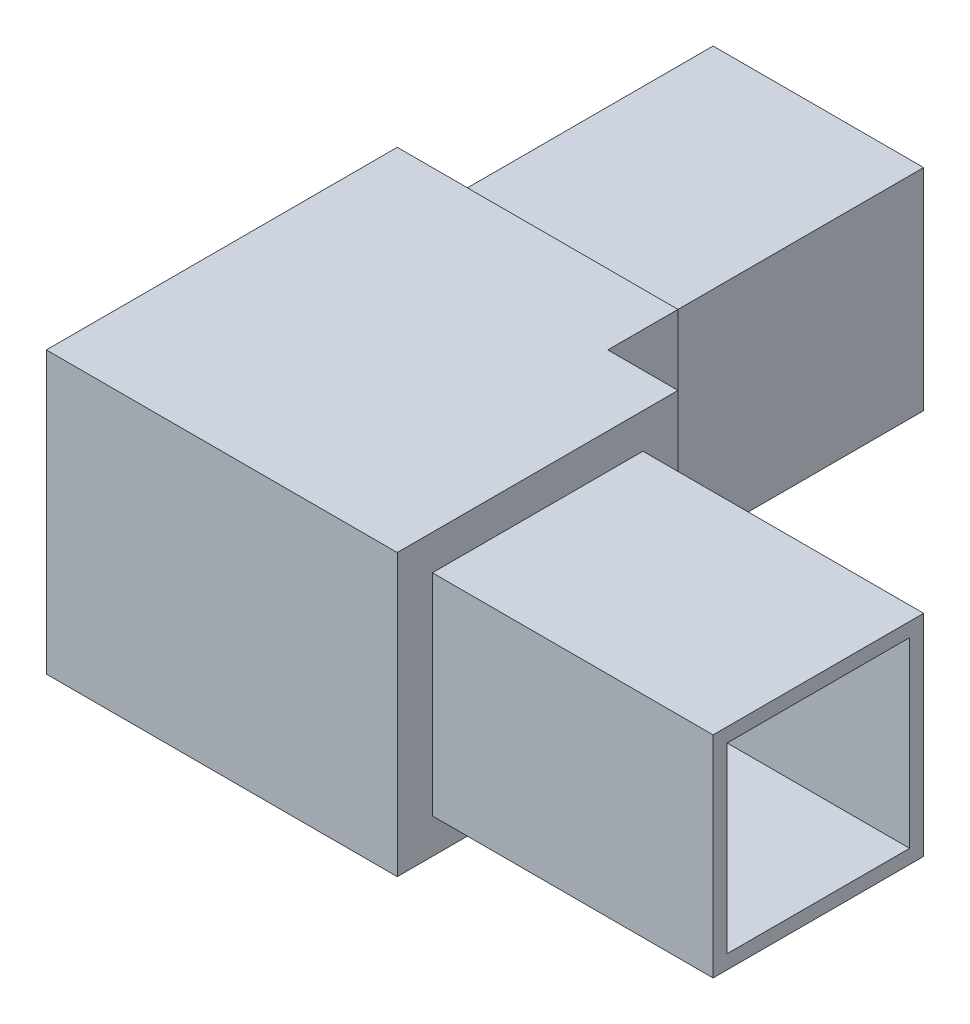
ISO-10303-21;
HEADER;
FILE_DESCRIPTION(('STEP AP214'),'2;1');
FILE_NAME('part.step','',(''),(''),'','','');
FILE_SCHEMA(('AUTOMOTIVE_DESIGN { 1 0 10303 214 1 1 1 1 }'));
ENDSEC;
DATA;
#1=APPLICATION_CONTEXT('core data for automotive mechanical design processes');
#2=APPLICATION_PROTOCOL_DEFINITION('international standard','automotive_design',2000,#1);
#3=PRODUCT_CONTEXT('',#1,'mechanical');
#4=PRODUCT('Part','Part','',(#3));
#5=PRODUCT_RELATED_PRODUCT_CATEGORY('part','',(#4));
#6=PRODUCT_DEFINITION_FORMATION('','',#4);
#7=PRODUCT_DEFINITION_CONTEXT('part definition',#1,'design');
#8=PRODUCT_DEFINITION('design','',#6,#7);
#9=PRODUCT_DEFINITION_SHAPE('','',#8);
#10=(LENGTH_UNIT() NAMED_UNIT(*) SI_UNIT(.MILLI.,.METRE.));
#11=(NAMED_UNIT(*) PLANE_ANGLE_UNIT() SI_UNIT($,.RADIAN.));
#12=(NAMED_UNIT(*) SI_UNIT($,.STERADIAN.) SOLID_ANGLE_UNIT());
#13=UNCERTAINTY_MEASURE_WITH_UNIT(LENGTH_MEASURE(1.E-05),#10,'distance_accuracy_value','');
#14=(GEOMETRIC_REPRESENTATION_CONTEXT(3) GLOBAL_UNCERTAINTY_ASSIGNED_CONTEXT((#13)) GLOBAL_UNIT_ASSIGNED_CONTEXT((#10,
#11,#12)) REPRESENTATION_CONTEXT('',''));
#15=CARTESIAN_POINT('',(0.,0.,0.));
#16=DIRECTION('',(0.,0.,1.));
#17=DIRECTION('',(1.,0.,0.));
#18=AXIS2_PLACEMENT_3D('',#15,#16,#17);
#19=CARTESIAN_POINT('',(70.,40.,-17.9567336544027));
#20=DIRECTION('',(-1.,0.,0.));
#21=DIRECTION('',(0.,0.,1.));
#22=AXIS2_PLACEMENT_3D('',#19,#20,#21);
#23=PLANE('',#22);
#24=DIRECTION('',(0.,-1.,0.));
#25=VECTOR('',#24,1.);
#26=CARTESIAN_POINT('',(70.,35.,15.));
#27=LINE('',#26,#25);
#28=CARTESIAN_POINT('',(70.,35.,15.));
#29=VERTEX_POINT('',#28);
#30=CARTESIAN_POINT('',(70.,5.,15.));
#31=VERTEX_POINT('',#30);
#32=EDGE_CURVE('E374',#29,#31,#27,.T.);
#33=ORIENTED_EDGE('',*,*,#32,.T.);
#34=DIRECTION('',(0.,0.,-1.));
#35=VECTOR('',#34,1.);
#36=CARTESIAN_POINT('',(70.,5.,15.));
#37=LINE('',#36,#35);
#38=CARTESIAN_POINT('',(70.,5.,-15.));
#39=VERTEX_POINT('',#38);
#40=EDGE_CURVE('E391',#31,#39,#37,.T.);
#41=ORIENTED_EDGE('',*,*,#40,.T.);
#42=DIRECTION('',(0.,1.,0.));
#43=VECTOR('',#42,1.);
#44=CARTESIAN_POINT('',(70.,5.,-15.));
#45=LINE('',#44,#43);
#46=CARTESIAN_POINT('',(70.,35.,-15.));
#47=VERTEX_POINT('',#46);
#48=EDGE_CURVE('E394',#39,#47,#45,.T.);
#49=ORIENTED_EDGE('',*,*,#48,.T.);
#50=DIRECTION('',(0.,0.,1.));
#51=VECTOR('',#50,1.);
#52=CARTESIAN_POINT('',(70.,35.,-15.));
#53=LINE('',#52,#51);
#54=EDGE_CURVE('E379',#47,#29,#53,.T.);
#55=ORIENTED_EDGE('',*,*,#54,.T.);
#56=EDGE_LOOP('',(#33,#41,#49,#55));
#57=FACE_BOUND('',#56,.T.);
#58=DIRECTION('',(0.,-1.,0.));
#59=VECTOR('',#58,1.);
#60=CARTESIAN_POINT('',(70.,35.,13.));
#61=LINE('',#60,#59);
#62=CARTESIAN_POINT('',(70.,33.,13.));
#63=VERTEX_POINT('',#62);
#64=CARTESIAN_POINT('',(70.,7.,13.));
#65=VERTEX_POINT('',#64);
#66=EDGE_CURVE('E230',#63,#65,#61,.T.);
#67=ORIENTED_EDGE('',*,*,#66,.F.);
#68=DIRECTION('',(0.,0.,1.));
#69=VECTOR('',#68,1.);
#70=CARTESIAN_POINT('',(70.,33.,-15.));
#71=LINE('',#70,#69);
#72=CARTESIAN_POINT('',(70.,33.,-13.));
#73=VERTEX_POINT('',#72);
#74=EDGE_CURVE('E288',#73,#63,#71,.T.);
#75=ORIENTED_EDGE('',*,*,#74,.F.);
#76=DIRECTION('',(0.,1.,0.));
#77=VECTOR('',#76,1.);
#78=CARTESIAN_POINT('',(70.,5.,-13.));
#79=LINE('',#78,#77);
#80=CARTESIAN_POINT('',(70.,7.,-13.));
#81=VERTEX_POINT('',#80);
#82=EDGE_CURVE('E47',#81,#73,#79,.T.);
#83=ORIENTED_EDGE('',*,*,#82,.F.);
#84=DIRECTION('',(0.,0.,-1.));
#85=VECTOR('',#84,1.);
#86=CARTESIAN_POINT('',(70.,7.,15.));
#87=LINE('',#86,#85);
#88=EDGE_CURVE('E319',#65,#81,#87,.T.);
#89=ORIENTED_EDGE('',*,*,#88,.F.);
#90=EDGE_LOOP('',(#67,#75,#83,#89));
#91=FACE_BOUND('',#90,.T.);
#92=ADVANCED_FACE('F32',(#57,#91),#23,.F.);
#93=CARTESIAN_POINT('',(-103.501393306404,40.,-17.9567336544027));
#94=DIRECTION('',(0.,1.,0.));
#95=DIRECTION('',(0.,0.,1.));
#96=AXIS2_PLACEMENT_3D('',#93,#94,#95);
#97=PLANE('',#96);
#98=DIRECTION('',(0.,0.,-1.));
#99=VECTOR('',#98,1.);
#100=CARTESIAN_POINT('',(20.,40.,-17.9567336544027));
#101=LINE('',#100,#99);
#102=CARTESIAN_POINT('',(20.,40.,-20.));
#103=VERTEX_POINT('',#102);
#104=CARTESIAN_POINT('',(20.,40.,-30.));
#105=VERTEX_POINT('',#104);
#106=EDGE_CURVE('E425',#103,#105,#101,.T.);
#107=ORIENTED_EDGE('',*,*,#106,.T.);
#108=DIRECTION('',(1.,0.,0.));
#109=VECTOR('',#108,1.);
#110=CARTESIAN_POINT('',(-20.,40.,-30.));
#111=LINE('',#110,#109);
#112=CARTESIAN_POINT('',(-20.,40.,-30.));
#113=VERTEX_POINT('',#112);
#114=EDGE_CURVE('E372',#113,#105,#111,.T.);
#115=ORIENTED_EDGE('',*,*,#114,.F.);
#116=DIRECTION('',(0.,0.,-1.));
#117=VECTOR('',#116,1.);
#118=CARTESIAN_POINT('',(-20.,40.,-17.9567336544027));
#119=LINE('',#118,#117);
#120=CARTESIAN_POINT('',(-20.,40.,20.));
#121=VERTEX_POINT('',#120);
#122=EDGE_CURVE('E416',#121,#113,#119,.T.);
#123=ORIENTED_EDGE('',*,*,#122,.F.);
#124=DIRECTION('',(-1.,0.,0.));
#125=VECTOR('',#124,1.);
#126=CARTESIAN_POINT('',(-103.501393306404,40.,20.));
#127=LINE('',#126,#125);
#128=CARTESIAN_POINT('',(30.,40.,20.));
#129=VERTEX_POINT('',#128);
#130=EDGE_CURVE('E419',#129,#121,#127,.T.);
#131=ORIENTED_EDGE('',*,*,#130,.F.);
#132=DIRECTION('',(0.,0.,1.));
#133=VECTOR('',#132,1.);
#134=CARTESIAN_POINT('',(30.,40.,-20.));
#135=LINE('',#134,#133);
#136=CARTESIAN_POINT('',(30.,40.,-20.));
#137=VERTEX_POINT('',#136);
#138=EDGE_CURVE('E413',#137,#129,#135,.T.);
#139=ORIENTED_EDGE('',*,*,#138,.F.);
#140=DIRECTION('',(1.,0.,0.));
#141=VECTOR('',#140,1.);
#142=CARTESIAN_POINT('',(-103.501393306404,40.,-20.));
#143=LINE('',#142,#141);
#144=EDGE_CURVE('E422',#103,#137,#143,.T.);
#145=ORIENTED_EDGE('',*,*,#144,.F.);
#146=EDGE_LOOP('',(#107,#115,#123,#131,#139,#145));
#147=FACE_BOUND('',#146,.T.);
#148=ADVANCED_FACE('F456',(#147),#97,.T.);
#149=CARTESIAN_POINT('',(-103.501393306404,0.,-17.9567336544027));
#150=DIRECTION('',(0.,1.,0.));
#151=DIRECTION('',(0.,0.,1.));
#152=AXIS2_PLACEMENT_3D('',#149,#150,#151);
#153=PLANE('',#152);
#154=DIRECTION('',(-1.,0.,0.));
#155=VECTOR('',#154,1.);
#156=CARTESIAN_POINT('',(20.,0.,-30.));
#157=LINE('',#156,#155);
#158=CARTESIAN_POINT('',(20.,0.,-30.));
#159=VERTEX_POINT('',#158);
#160=CARTESIAN_POINT('',(-20.,0.,-30.));
#161=VERTEX_POINT('',#160);
#162=EDGE_CURVE('E368',#159,#161,#157,.T.);
#163=ORIENTED_EDGE('',*,*,#162,.F.);
#164=DIRECTION('',(0.,0.,-1.));
#165=VECTOR('',#164,1.);
#166=CARTESIAN_POINT('',(20.,0.,-17.9567336544027));
#167=LINE('',#166,#165);
#168=CARTESIAN_POINT('',(20.,0.,-20.));
#169=VERTEX_POINT('',#168);
#170=EDGE_CURVE('E420',#169,#159,#167,.T.);
#171=ORIENTED_EDGE('',*,*,#170,.F.);
#172=DIRECTION('',(1.,0.,0.));
#173=VECTOR('',#172,1.);
#174=CARTESIAN_POINT('',(-103.501393306404,0.,-20.));
#175=LINE('',#174,#173);
#176=CARTESIAN_POINT('',(30.,0.,-20.));
#177=VERTEX_POINT('',#176);
#178=EDGE_CURVE('E432',#169,#177,#175,.T.);
#179=ORIENTED_EDGE('',*,*,#178,.T.);
#180=DIRECTION('',(0.,0.,-1.));
#181=VECTOR('',#180,1.);
#182=CARTESIAN_POINT('',(30.,0.,20.));
#183=LINE('',#182,#181);
#184=CARTESIAN_POINT('',(30.,0.,20.));
#185=VERTEX_POINT('',#184);
#186=EDGE_CURVE('E409',#185,#177,#183,.T.);
#187=ORIENTED_EDGE('',*,*,#186,.F.);
#188=DIRECTION('',(-1.,0.,0.));
#189=VECTOR('',#188,1.);
#190=CARTESIAN_POINT('',(-103.501393306404,0.,20.));
#191=LINE('',#190,#189);
#192=CARTESIAN_POINT('',(-20.,0.,20.));
#193=VERTEX_POINT('',#192);
#194=EDGE_CURVE('E430',#185,#193,#191,.T.);
#195=ORIENTED_EDGE('',*,*,#194,.T.);
#196=DIRECTION('',(0.,0.,-1.));
#197=VECTOR('',#196,1.);
#198=CARTESIAN_POINT('',(-20.,0.,-17.9567336544027));
#199=LINE('',#198,#197);
#200=EDGE_CURVE('E415',#193,#161,#199,.T.);
#201=ORIENTED_EDGE('',*,*,#200,.T.);
#202=EDGE_LOOP('',(#163,#171,#179,#187,#195,#201));
#203=FACE_BOUND('',#202,.T.);
#204=ADVANCED_FACE('F446',(#203),#153,.F.);
#205=CARTESIAN_POINT('',(-20.,40.,-17.9567336544027));
#206=DIRECTION('',(-1.,0.,0.));
#207=DIRECTION('',(0.,0.,1.));
#208=AXIS2_PLACEMENT_3D('',#205,#206,#207);
#209=PLANE('',#208);
#210=ORIENTED_EDGE('',*,*,#122,.T.);
#211=DIRECTION('',(0.,1.,0.));
#212=VECTOR('',#211,1.);
#213=CARTESIAN_POINT('',(-20.,0.,-30.));
#214=LINE('',#213,#212);
#215=EDGE_CURVE('E370',#161,#113,#214,.T.);
#216=ORIENTED_EDGE('',*,*,#215,.F.);
#217=ORIENTED_EDGE('',*,*,#200,.F.);
#218=DIRECTION('',(0.,-1.,0.));
#219=VECTOR('',#218,1.);
#220=CARTESIAN_POINT('',(-20.,40.,20.));
#221=LINE('',#220,#219);
#222=EDGE_CURVE('E11',#121,#193,#221,.T.);
#223=ORIENTED_EDGE('',*,*,#222,.F.);
#224=EDGE_LOOP('',(#210,#216,#217,#223));
#225=FACE_BOUND('',#224,.T.);
#226=ADVANCED_FACE('F34',(#225),#209,.T.);
#227=CARTESIAN_POINT('',(20.,40.,-17.9567336544027));
#228=DIRECTION('',(-1.,0.,0.));
#229=DIRECTION('',(0.,0.,1.));
#230=AXIS2_PLACEMENT_3D('',#227,#228,#229);
#231=PLANE('',#230);
#232=DIRECTION('',(0.,-1.,0.));
#233=VECTOR('',#232,1.);
#234=CARTESIAN_POINT('',(20.,40.,-30.));
#235=LINE('',#234,#233);
#236=EDGE_CURVE('E360',#105,#159,#235,.T.);
#237=ORIENTED_EDGE('',*,*,#236,.F.);
#238=ORIENTED_EDGE('',*,*,#106,.F.);
#239=DIRECTION('',(0.,-1.,0.));
#240=VECTOR('',#239,1.);
#241=CARTESIAN_POINT('',(20.,40.,-20.));
#242=LINE('',#241,#240);
#243=EDGE_CURVE('E40',#103,#169,#242,.T.);
#244=ORIENTED_EDGE('',*,*,#243,.T.);
#245=ORIENTED_EDGE('',*,*,#170,.T.);
#246=EDGE_LOOP('',(#237,#238,#244,#245));
#247=FACE_BOUND('',#246,.T.);
#248=ADVANCED_FACE('F440',(#247),#231,.F.);
#249=CARTESIAN_POINT('',(-103.501393306404,40.,20.));
#250=DIRECTION('',(0.,0.,1.));
#251=DIRECTION('',(1.,0.,0.));
#252=AXIS2_PLACEMENT_3D('',#249,#250,#251);
#253=PLANE('',#252);
#254=ORIENTED_EDGE('',*,*,#194,.F.);
#255=DIRECTION('',(0.,-1.,0.));
#256=VECTOR('',#255,1.);
#257=CARTESIAN_POINT('',(30.,40.,20.));
#258=LINE('',#257,#256);
#259=EDGE_CURVE('E401',#129,#185,#258,.T.);
#260=ORIENTED_EDGE('',*,*,#259,.F.);
#261=ORIENTED_EDGE('',*,*,#130,.T.);
#262=ORIENTED_EDGE('',*,*,#222,.T.);
#263=EDGE_LOOP('',(#254,#260,#261,#262));
#264=FACE_BOUND('',#263,.T.);
#265=ADVANCED_FACE('F462',(#264),#253,.T.);
#266=CARTESIAN_POINT('',(-103.501393306404,40.,-20.));
#267=DIRECTION('',(0.,0.,-1.));
#268=DIRECTION('',(-1.,0.,0.));
#269=AXIS2_PLACEMENT_3D('',#266,#267,#268);
#270=PLANE('',#269);
#271=ORIENTED_EDGE('',*,*,#144,.T.);
#272=DIRECTION('',(0.,1.,0.));
#273=VECTOR('',#272,1.);
#274=CARTESIAN_POINT('',(30.,0.,-20.));
#275=LINE('',#274,#273);
#276=EDGE_CURVE('E411',#177,#137,#275,.T.);
#277=ORIENTED_EDGE('',*,*,#276,.F.);
#278=ORIENTED_EDGE('',*,*,#178,.F.);
#279=ORIENTED_EDGE('',*,*,#243,.F.);
#280=EDGE_LOOP('',(#271,#277,#278,#279));
#281=FACE_BOUND('',#280,.T.);
#282=ADVANCED_FACE('F449',(#281),#270,.T.);
#283=CARTESIAN_POINT('',(30.,0.,20.));
#284=DIRECTION('',(1.,0.,0.));
#285=DIRECTION('',(0.,0.,-1.));
#286=AXIS2_PLACEMENT_3D('',#283,#284,#285);
#287=PLANE('',#286);
#288=DIRECTION('',(0.,0.,1.));
#289=VECTOR('',#288,1.);
#290=CARTESIAN_POINT('',(30.,35.,-15.));
#291=LINE('',#290,#289);
#292=CARTESIAN_POINT('',(30.,35.,-15.));
#293=VERTEX_POINT('',#292);
#294=CARTESIAN_POINT('',(30.,35.,15.));
#295=VERTEX_POINT('',#294);
#296=EDGE_CURVE('E385',#293,#295,#291,.T.);
#297=ORIENTED_EDGE('',*,*,#296,.F.);
#298=DIRECTION('',(0.,1.,0.));
#299=VECTOR('',#298,1.);
#300=CARTESIAN_POINT('',(30.,5.,-15.));
#301=LINE('',#300,#299);
#302=CARTESIAN_POINT('',(30.,5.,-15.));
#303=VERTEX_POINT('',#302);
#304=EDGE_CURVE('E382',#303,#293,#301,.T.);
#305=ORIENTED_EDGE('',*,*,#304,.F.);
#306=DIRECTION('',(0.,0.,-1.));
#307=VECTOR('',#306,1.);
#308=CARTESIAN_POINT('',(30.,5.,15.));
#309=LINE('',#308,#307);
#310=CARTESIAN_POINT('',(30.,5.,15.));
#311=VERTEX_POINT('',#310);
#312=EDGE_CURVE('E378',#311,#303,#309,.T.);
#313=ORIENTED_EDGE('',*,*,#312,.F.);
#314=DIRECTION('',(0.,-1.,0.));
#315=VECTOR('',#314,1.);
#316=CARTESIAN_POINT('',(30.,35.,15.));
#317=LINE('',#316,#315);
#318=EDGE_CURVE('E375',#295,#311,#317,.T.);
#319=ORIENTED_EDGE('',*,*,#318,.F.);
#320=EDGE_LOOP('',(#297,#305,#313,#319));
#321=FACE_BOUND('',#320,.T.);
#322=ORIENTED_EDGE('',*,*,#259,.T.);
#323=ORIENTED_EDGE('',*,*,#186,.T.);
#324=ORIENTED_EDGE('',*,*,#276,.T.);
#325=ORIENTED_EDGE('',*,*,#138,.T.);
#326=EDGE_LOOP('',(#322,#323,#324,#325));
#327=FACE_BOUND('',#326,.T.);
#328=ADVANCED_FACE('F452',(#321,#327),#287,.T.);
#329=CARTESIAN_POINT('',(30.,35.,15.));
#330=DIRECTION('',(0.,0.,1.));
#331=DIRECTION('',(1.,0.,0.));
#332=AXIS2_PLACEMENT_3D('',#329,#330,#331);
#333=PLANE('',#332);
#334=ORIENTED_EDGE('',*,*,#32,.F.);
#335=DIRECTION('',(1.,0.,0.));
#336=VECTOR('',#335,1.);
#337=CARTESIAN_POINT('',(30.,35.,15.));
#338=LINE('',#337,#336);
#339=EDGE_CURVE('E399',#295,#29,#338,.T.);
#340=ORIENTED_EDGE('',*,*,#339,.F.);
#341=ORIENTED_EDGE('',*,*,#318,.T.);
#342=DIRECTION('',(1.,0.,0.));
#343=VECTOR('',#342,1.);
#344=CARTESIAN_POINT('',(30.,5.,15.));
#345=LINE('',#344,#343);
#346=EDGE_CURVE('E388',#311,#31,#345,.T.);
#347=ORIENTED_EDGE('',*,*,#346,.T.);
#348=EDGE_LOOP('',(#334,#340,#341,#347));
#349=FACE_BOUND('',#348,.T.);
#350=ADVANCED_FACE('F513',(#349),#333,.T.);
#351=CARTESIAN_POINT('',(30.,35.,-15.));
#352=DIRECTION('',(0.,1.,0.));
#353=DIRECTION('',(0.,0.,1.));
#354=AXIS2_PLACEMENT_3D('',#351,#352,#353);
#355=PLANE('',#354);
#356=ORIENTED_EDGE('',*,*,#54,.F.);
#357=DIRECTION('',(1.,0.,0.));
#358=VECTOR('',#357,1.);
#359=CARTESIAN_POINT('',(30.,35.,-15.));
#360=LINE('',#359,#358);
#361=EDGE_CURVE('E402',#293,#47,#360,.T.);
#362=ORIENTED_EDGE('',*,*,#361,.F.);
#363=ORIENTED_EDGE('',*,*,#296,.T.);
#364=ORIENTED_EDGE('',*,*,#339,.T.);
#365=EDGE_LOOP('',(#356,#362,#363,#364));
#366=FACE_BOUND('',#365,.T.);
#367=ADVANCED_FACE('F516',(#366),#355,.T.);
#368=CARTESIAN_POINT('',(30.,5.,-15.));
#369=DIRECTION('',(0.,0.,-1.));
#370=DIRECTION('',(-1.,0.,0.));
#371=AXIS2_PLACEMENT_3D('',#368,#369,#370);
#372=PLANE('',#371);
#373=ORIENTED_EDGE('',*,*,#48,.F.);
#374=DIRECTION('',(1.,0.,0.));
#375=VECTOR('',#374,1.);
#376=CARTESIAN_POINT('',(30.,5.,-15.));
#377=LINE('',#376,#375);
#378=EDGE_CURVE('E404',#303,#39,#377,.T.);
#379=ORIENTED_EDGE('',*,*,#378,.F.);
#380=ORIENTED_EDGE('',*,*,#304,.T.);
#381=ORIENTED_EDGE('',*,*,#361,.T.);
#382=EDGE_LOOP('',(#373,#379,#380,#381));
#383=FACE_BOUND('',#382,.T.);
#384=ADVANCED_FACE('F480',(#383),#372,.T.);
#385=CARTESIAN_POINT('',(30.,5.,15.));
#386=DIRECTION('',(0.,-1.,0.));
#387=DIRECTION('',(0.,0.,-1.));
#388=AXIS2_PLACEMENT_3D('',#385,#386,#387);
#389=PLANE('',#388);
#390=ORIENTED_EDGE('',*,*,#40,.F.);
#391=ORIENTED_EDGE('',*,*,#346,.F.);
#392=ORIENTED_EDGE('',*,*,#312,.T.);
#393=ORIENTED_EDGE('',*,*,#378,.T.);
#394=EDGE_LOOP('',(#390,#391,#392,#393));
#395=FACE_BOUND('',#394,.T.);
#396=ADVANCED_FACE('F470',(#395),#389,.T.);
#397=CARTESIAN_POINT('',(20.,0.,-30.));
#398=DIRECTION('',(0.,0.,-1.));
#399=DIRECTION('',(-1.,0.,0.));
#400=AXIS2_PLACEMENT_3D('',#397,#398,#399);
#401=PLANE('',#400);
#402=DIRECTION('',(1.,0.,0.));
#403=VECTOR('',#402,1.);
#404=CARTESIAN_POINT('',(-15.,35.,-30.));
#405=LINE('',#404,#403);
#406=CARTESIAN_POINT('',(-15.,35.,-30.));
#407=VERTEX_POINT('',#406);
#408=CARTESIAN_POINT('',(15.,35.,-30.));
#409=VERTEX_POINT('',#408);
#410=EDGE_CURVE('E344',#407,#409,#405,.T.);
#411=ORIENTED_EDGE('',*,*,#410,.F.);
#412=DIRECTION('',(0.,1.,0.));
#413=VECTOR('',#412,1.);
#414=CARTESIAN_POINT('',(-15.,5.,-30.));
#415=LINE('',#414,#413);
#416=CARTESIAN_POINT('',(-15.,5.,-30.));
#417=VERTEX_POINT('',#416);
#418=EDGE_CURVE('E341',#417,#407,#415,.T.);
#419=ORIENTED_EDGE('',*,*,#418,.F.);
#420=DIRECTION('',(-1.,0.,0.));
#421=VECTOR('',#420,1.);
#422=CARTESIAN_POINT('',(15.,5.,-30.));
#423=LINE('',#422,#421);
#424=CARTESIAN_POINT('',(15.,5.,-30.));
#425=VERTEX_POINT('',#424);
#426=EDGE_CURVE('E337',#425,#417,#423,.T.);
#427=ORIENTED_EDGE('',*,*,#426,.F.);
#428=DIRECTION('',(0.,-1.,0.));
#429=VECTOR('',#428,1.);
#430=CARTESIAN_POINT('',(15.,35.,-30.));
#431=LINE('',#430,#429);
#432=EDGE_CURVE('E334',#409,#425,#431,.T.);
#433=ORIENTED_EDGE('',*,*,#432,.F.);
#434=EDGE_LOOP('',(#411,#419,#427,#433));
#435=FACE_BOUND('',#434,.T.);
#436=ORIENTED_EDGE('',*,*,#236,.T.);
#437=ORIENTED_EDGE('',*,*,#162,.T.);
#438=ORIENTED_EDGE('',*,*,#215,.T.);
#439=ORIENTED_EDGE('',*,*,#114,.T.);
#440=EDGE_LOOP('',(#436,#437,#438,#439));
#441=FACE_BOUND('',#440,.T.);
#442=ADVANCED_FACE('F467',(#435,#441),#401,.T.);
#443=CARTESIAN_POINT('',(15.,35.,-30.));
#444=DIRECTION('',(1.,0.,0.));
#445=DIRECTION('',(0.,0.,-1.));
#446=AXIS2_PLACEMENT_3D('',#443,#444,#445);
#447=PLANE('',#446);
#448=DIRECTION('',(0.,-1.,0.));
#449=VECTOR('',#448,1.);
#450=CARTESIAN_POINT('',(15.,35.,-70.));
#451=LINE('',#450,#449);
#452=CARTESIAN_POINT('',(15.,35.,-70.));
#453=VERTEX_POINT('',#452);
#454=CARTESIAN_POINT('',(15.,5.,-70.));
#455=VERTEX_POINT('',#454);
#456=EDGE_CURVE('E264',#453,#455,#451,.T.);
#457=ORIENTED_EDGE('',*,*,#456,.F.);
#458=DIRECTION('',(0.,0.,-1.));
#459=VECTOR('',#458,1.);
#460=CARTESIAN_POINT('',(15.,35.,-30.));
#461=LINE('',#460,#459);
#462=EDGE_CURVE('E358',#409,#453,#461,.T.);
#463=ORIENTED_EDGE('',*,*,#462,.F.);
#464=ORIENTED_EDGE('',*,*,#432,.T.);
#465=DIRECTION('',(0.,0.,-1.));
#466=VECTOR('',#465,1.);
#467=CARTESIAN_POINT('',(15.,5.,-30.));
#468=LINE('',#467,#466);
#469=EDGE_CURVE('E347',#425,#455,#468,.T.);
#470=ORIENTED_EDGE('',*,*,#469,.T.);
#471=EDGE_LOOP('',(#457,#463,#464,#470));
#472=FACE_BOUND('',#471,.T.);
#473=ADVANCED_FACE('F469',(#472),#447,.T.);
#474=CARTESIAN_POINT('',(-15.,35.,-30.));
#475=DIRECTION('',(0.,1.,0.));
#476=DIRECTION('',(0.,0.,1.));
#477=AXIS2_PLACEMENT_3D('',#474,#475,#476);
#478=PLANE('',#477);
#479=DIRECTION('',(1.,0.,0.));
#480=VECTOR('',#479,1.);
#481=CARTESIAN_POINT('',(-15.,35.,-70.));
#482=LINE('',#481,#480);
#483=CARTESIAN_POINT('',(-15.,35.,-70.));
#484=VERTEX_POINT('',#483);
#485=EDGE_CURVE('E338',#484,#453,#482,.T.);
#486=ORIENTED_EDGE('',*,*,#485,.F.);
#487=DIRECTION('',(0.,0.,-1.));
#488=VECTOR('',#487,1.);
#489=CARTESIAN_POINT('',(-15.,35.,-30.));
#490=LINE('',#489,#488);
#491=EDGE_CURVE('E361',#407,#484,#490,.T.);
#492=ORIENTED_EDGE('',*,*,#491,.F.);
#493=ORIENTED_EDGE('',*,*,#410,.T.);
#494=ORIENTED_EDGE('',*,*,#462,.T.);
#495=EDGE_LOOP('',(#486,#492,#493,#494));
#496=FACE_BOUND('',#495,.T.);
#497=ADVANCED_FACE('F477',(#496),#478,.T.);
#498=CARTESIAN_POINT('',(-15.,5.,-30.));
#499=DIRECTION('',(-1.,0.,0.));
#500=DIRECTION('',(0.,0.,1.));
#501=AXIS2_PLACEMENT_3D('',#498,#499,#500);
#502=PLANE('',#501);
#503=DIRECTION('',(0.,1.,0.));
#504=VECTOR('',#503,1.);
#505=CARTESIAN_POINT('',(-15.,5.,-70.));
#506=LINE('',#505,#504);
#507=CARTESIAN_POINT('',(-15.,5.,-70.));
#508=VERTEX_POINT('',#507);
#509=EDGE_CURVE('E353',#508,#484,#506,.T.);
#510=ORIENTED_EDGE('',*,*,#509,.F.);
#511=DIRECTION('',(0.,0.,-1.));
#512=VECTOR('',#511,1.);
#513=CARTESIAN_POINT('',(-15.,5.,-30.));
#514=LINE('',#513,#512);
#515=EDGE_CURVE('E363',#417,#508,#514,.T.);
#516=ORIENTED_EDGE('',*,*,#515,.F.);
#517=ORIENTED_EDGE('',*,*,#418,.T.);
#518=ORIENTED_EDGE('',*,*,#491,.T.);
#519=EDGE_LOOP('',(#510,#516,#517,#518));
#520=FACE_BOUND('',#519,.T.);
#521=ADVANCED_FACE('F589',(#520),#502,.T.);
#522=CARTESIAN_POINT('',(15.,5.,-30.));
#523=DIRECTION('',(0.,-1.,0.));
#524=DIRECTION('',(0.,0.,-1.));
#525=AXIS2_PLACEMENT_3D('',#522,#523,#524);
#526=PLANE('',#525);
#527=DIRECTION('',(-1.,0.,0.));
#528=VECTOR('',#527,1.);
#529=CARTESIAN_POINT('',(15.,5.,-70.));
#530=LINE('',#529,#528);
#531=EDGE_CURVE('E350',#455,#508,#530,.T.);
#532=ORIENTED_EDGE('',*,*,#531,.F.);
#533=ORIENTED_EDGE('',*,*,#469,.F.);
#534=ORIENTED_EDGE('',*,*,#426,.T.);
#535=ORIENTED_EDGE('',*,*,#515,.T.);
#536=EDGE_LOOP('',(#532,#533,#534,#535));
#537=FACE_BOUND('',#536,.T.);
#538=ADVANCED_FACE('F507',(#537),#526,.T.);
#539=CARTESIAN_POINT('',(-103.501393306404,40.,-70.));
#540=DIRECTION('',(0.,0.,-1.));
#541=DIRECTION('',(-1.,0.,0.));
#542=AXIS2_PLACEMENT_3D('',#539,#540,#541);
#543=PLANE('',#542);
#544=DIRECTION('',(1.,0.,0.));
#545=VECTOR('',#544,1.);
#546=CARTESIAN_POINT('',(-103.501393306404,33.,-70.));
#547=LINE('',#546,#545);
#548=CARTESIAN_POINT('',(-13.,33.,-70.));
#549=VERTEX_POINT('',#548);
#550=CARTESIAN_POINT('',(13.,33.,-70.));
#551=VERTEX_POINT('',#550);
#552=EDGE_CURVE('E310',#549,#551,#547,.T.);
#553=ORIENTED_EDGE('',*,*,#552,.F.);
#554=DIRECTION('',(0.,1.,0.));
#555=VECTOR('',#554,1.);
#556=CARTESIAN_POINT('',(-13.,40.,-70.));
#557=LINE('',#556,#555);
#558=CARTESIAN_POINT('',(-13.,7.,-70.));
#559=VERTEX_POINT('',#558);
#560=EDGE_CURVE('E329',#559,#549,#557,.T.);
#561=ORIENTED_EDGE('',*,*,#560,.F.);
#562=DIRECTION('',(-1.,0.,0.));
#563=VECTOR('',#562,1.);
#564=CARTESIAN_POINT('',(-103.501393306404,7.,-70.));
#565=LINE('',#564,#563);
#566=CARTESIAN_POINT('',(13.,7.,-70.));
#567=VERTEX_POINT('',#566);
#568=EDGE_CURVE('E55',#567,#559,#565,.T.);
#569=ORIENTED_EDGE('',*,*,#568,.F.);
#570=DIRECTION('',(0.,-1.,0.));
#571=VECTOR('',#570,1.);
#572=CARTESIAN_POINT('',(13.,40.,-70.));
#573=LINE('',#572,#571);
#574=EDGE_CURVE('E325',#551,#567,#573,.T.);
#575=ORIENTED_EDGE('',*,*,#574,.F.);
#576=EDGE_LOOP('',(#553,#561,#569,#575));
#577=FACE_BOUND('',#576,.T.);
#578=ORIENTED_EDGE('',*,*,#485,.T.);
#579=ORIENTED_EDGE('',*,*,#456,.T.);
#580=ORIENTED_EDGE('',*,*,#531,.T.);
#581=ORIENTED_EDGE('',*,*,#509,.T.);
#582=EDGE_LOOP('',(#578,#579,#580,#581));
#583=FACE_BOUND('',#582,.T.);
#584=ADVANCED_FACE('F504',(#577,#583),#543,.T.);
#585=CARTESIAN_POINT('',(-103.501393306404,38.,-17.9567336544027));
#586=DIRECTION('',(0.,1.,0.));
#587=DIRECTION('',(0.,0.,1.));
#588=AXIS2_PLACEMENT_3D('',#585,#586,#587);
#589=PLANE('',#588);
#590=DIRECTION('',(0.,0.,-1.));
#591=VECTOR('',#590,1.);
#592=CARTESIAN_POINT('',(18.,38.,-17.9567336544027));
#593=LINE('',#592,#591);
#594=CARTESIAN_POINT('',(18.,38.,-18.));
#595=VERTEX_POINT('',#594);
#596=CARTESIAN_POINT('',(18.,38.,-28.));
#597=VERTEX_POINT('',#596);
#598=EDGE_CURVE('E224',#595,#597,#593,.T.);
#599=ORIENTED_EDGE('',*,*,#598,.F.);
#600=DIRECTION('',(1.,0.,0.));
#601=VECTOR('',#600,1.);
#602=CARTESIAN_POINT('',(-103.501393306404,38.,-18.));
#603=LINE('',#602,#601);
#604=CARTESIAN_POINT('',(28.,38.,-18.));
#605=VERTEX_POINT('',#604);
#606=EDGE_CURVE('E244',#595,#605,#603,.T.);
#607=ORIENTED_EDGE('',*,*,#606,.T.);
#608=DIRECTION('',(0.,0.,1.));
#609=VECTOR('',#608,1.);
#610=CARTESIAN_POINT('',(28.,38.,20.));
#611=LINE('',#610,#609);
#612=CARTESIAN_POINT('',(28.,38.,18.));
#613=VERTEX_POINT('',#612);
#614=EDGE_CURVE('E254',#605,#613,#611,.T.);
#615=ORIENTED_EDGE('',*,*,#614,.T.);
#616=DIRECTION('',(-1.,0.,0.));
#617=VECTOR('',#616,1.);
#618=CARTESIAN_POINT('',(-103.501393306404,38.,18.));
#619=LINE('',#618,#617);
#620=CARTESIAN_POINT('',(-18.,38.,18.));
#621=VERTEX_POINT('',#620);
#622=EDGE_CURVE('E248',#613,#621,#619,.T.);
#623=ORIENTED_EDGE('',*,*,#622,.T.);
#624=DIRECTION('',(0.,0.,-1.));
#625=VECTOR('',#624,1.);
#626=CARTESIAN_POINT('',(-18.,38.,-17.9567336544027));
#627=LINE('',#626,#625);
#628=CARTESIAN_POINT('',(-18.,38.,-28.));
#629=VERTEX_POINT('',#628);
#630=EDGE_CURVE('E227',#621,#629,#627,.T.);
#631=ORIENTED_EDGE('',*,*,#630,.T.);
#632=DIRECTION('',(1.,0.,0.));
#633=VECTOR('',#632,1.);
#634=CARTESIAN_POINT('',(20.,38.,-28.));
#635=LINE('',#634,#633);
#636=EDGE_CURVE('E219',#629,#597,#635,.T.);
#637=ORIENTED_EDGE('',*,*,#636,.T.);
#638=EDGE_LOOP('',(#599,#607,#615,#623,#631,#637));
#639=FACE_BOUND('',#638,.T.);
#640=ADVANCED_FACE('F221',(#639),#589,.F.);
#641=CARTESIAN_POINT('',(-103.501393306404,2.,-17.9567336544027));
#642=DIRECTION('',(0.,1.,0.));
#643=DIRECTION('',(0.,0.,1.));
#644=AXIS2_PLACEMENT_3D('',#641,#642,#643);
#645=PLANE('',#644);
#646=DIRECTION('',(-1.,0.,0.));
#647=VECTOR('',#646,1.);
#648=CARTESIAN_POINT('',(-103.501393306404,2.,-28.));
#649=LINE('',#648,#647);
#650=CARTESIAN_POINT('',(18.,2.,-28.));
#651=VERTEX_POINT('',#650);
#652=CARTESIAN_POINT('',(-18.,2.,-28.));
#653=VERTEX_POINT('',#652);
#654=EDGE_CURVE('E236',#651,#653,#649,.T.);
#655=ORIENTED_EDGE('',*,*,#654,.T.);
#656=DIRECTION('',(0.,0.,-1.));
#657=VECTOR('',#656,1.);
#658=CARTESIAN_POINT('',(-18.,2.,-17.9567336544027));
#659=LINE('',#658,#657);
#660=CARTESIAN_POINT('',(-18.,2.,18.));
#661=VERTEX_POINT('',#660);
#662=EDGE_CURVE('E255',#661,#653,#659,.T.);
#663=ORIENTED_EDGE('',*,*,#662,.F.);
#664=DIRECTION('',(-1.,0.,0.));
#665=VECTOR('',#664,1.);
#666=CARTESIAN_POINT('',(-103.501393306404,2.,18.));
#667=LINE('',#666,#665);
#668=CARTESIAN_POINT('',(28.,2.,18.));
#669=VERTEX_POINT('',#668);
#670=EDGE_CURVE('E261',#669,#661,#667,.T.);
#671=ORIENTED_EDGE('',*,*,#670,.F.);
#672=DIRECTION('',(0.,0.,-1.));
#673=VECTOR('',#672,1.);
#674=CARTESIAN_POINT('',(28.,2.,-17.9567336544027));
#675=LINE('',#674,#673);
#676=CARTESIAN_POINT('',(28.,2.,-18.));
#677=VERTEX_POINT('',#676);
#678=EDGE_CURVE('E270',#669,#677,#675,.T.);
#679=ORIENTED_EDGE('',*,*,#678,.T.);
#680=DIRECTION('',(1.,0.,0.));
#681=VECTOR('',#680,1.);
#682=CARTESIAN_POINT('',(-103.501393306404,2.,-18.));
#683=LINE('',#682,#681);
#684=CARTESIAN_POINT('',(18.,2.,-18.));
#685=VERTEX_POINT('',#684);
#686=EDGE_CURVE('E267',#685,#677,#683,.T.);
#687=ORIENTED_EDGE('',*,*,#686,.F.);
#688=DIRECTION('',(0.,0.,-1.));
#689=VECTOR('',#688,1.);
#690=CARTESIAN_POINT('',(18.,2.,-17.9567336544027));
#691=LINE('',#690,#689);
#692=EDGE_CURVE('E252',#685,#651,#691,.T.);
#693=ORIENTED_EDGE('',*,*,#692,.T.);
#694=EDGE_LOOP('',(#655,#663,#671,#679,#687,#693));
#695=FACE_BOUND('',#694,.T.);
#696=ADVANCED_FACE('F627',(#695),#645,.T.);
#697=CARTESIAN_POINT('',(-18.,40.,-17.9567336544027));
#698=DIRECTION('',(-1.,0.,0.));
#699=DIRECTION('',(0.,0.,1.));
#700=AXIS2_PLACEMENT_3D('',#697,#698,#699);
#701=PLANE('',#700);
#702=ORIENTED_EDGE('',*,*,#630,.F.);
#703=DIRECTION('',(0.,-1.,0.));
#704=VECTOR('',#703,1.);
#705=CARTESIAN_POINT('',(-18.,40.,18.));
#706=LINE('',#705,#704);
#707=EDGE_CURVE('E246',#621,#661,#706,.T.);
#708=ORIENTED_EDGE('',*,*,#707,.T.);
#709=ORIENTED_EDGE('',*,*,#662,.T.);
#710=DIRECTION('',(0.,1.,0.));
#711=VECTOR('',#710,1.);
#712=CARTESIAN_POINT('',(-18.,0.,-28.));
#713=LINE('',#712,#711);
#714=EDGE_CURVE('E231',#653,#629,#713,.T.);
#715=ORIENTED_EDGE('',*,*,#714,.T.);
#716=EDGE_LOOP('',(#702,#708,#709,#715));
#717=FACE_BOUND('',#716,.T.);
#718=ADVANCED_FACE('F638',(#717),#701,.F.);
#719=CARTESIAN_POINT('',(18.,40.,-17.9567336544027));
#720=DIRECTION('',(-1.,0.,0.));
#721=DIRECTION('',(0.,0.,1.));
#722=AXIS2_PLACEMENT_3D('',#719,#720,#721);
#723=PLANE('',#722);
#724=DIRECTION('',(0.,-1.,0.));
#725=VECTOR('',#724,1.);
#726=CARTESIAN_POINT('',(18.,40.,-28.));
#727=LINE('',#726,#725);
#728=EDGE_CURVE('E234',#597,#651,#727,.T.);
#729=ORIENTED_EDGE('',*,*,#728,.T.);
#730=ORIENTED_EDGE('',*,*,#692,.F.);
#731=DIRECTION('',(0.,-1.,0.));
#732=VECTOR('',#731,1.);
#733=CARTESIAN_POINT('',(18.,40.,-18.));
#734=LINE('',#733,#732);
#735=EDGE_CURVE('E243',#595,#685,#734,.T.);
#736=ORIENTED_EDGE('',*,*,#735,.F.);
#737=ORIENTED_EDGE('',*,*,#598,.T.);
#738=EDGE_LOOP('',(#729,#730,#736,#737));
#739=FACE_BOUND('',#738,.T.);
#740=ADVANCED_FACE('F242',(#739),#723,.T.);
#741=CARTESIAN_POINT('',(-103.501393306404,40.,18.));
#742=DIRECTION('',(0.,0.,1.));
#743=DIRECTION('',(1.,0.,0.));
#744=AXIS2_PLACEMENT_3D('',#741,#742,#743);
#745=PLANE('',#744);
#746=ORIENTED_EDGE('',*,*,#670,.T.);
#747=ORIENTED_EDGE('',*,*,#707,.F.);
#748=ORIENTED_EDGE('',*,*,#622,.F.);
#749=DIRECTION('',(0.,-1.,0.));
#750=VECTOR('',#749,1.);
#751=CARTESIAN_POINT('',(28.,0.,18.));
#752=LINE('',#751,#750);
#753=EDGE_CURVE('E272',#613,#669,#752,.T.);
#754=ORIENTED_EDGE('',*,*,#753,.T.);
#755=EDGE_LOOP('',(#746,#747,#748,#754));
#756=FACE_BOUND('',#755,.T.);
#757=ADVANCED_FACE('F659',(#756),#745,.F.);
#758=CARTESIAN_POINT('',(-103.501393306404,40.,-18.));
#759=DIRECTION('',(0.,0.,-1.));
#760=DIRECTION('',(-1.,0.,0.));
#761=AXIS2_PLACEMENT_3D('',#758,#759,#760);
#762=PLANE('',#761);
#763=ORIENTED_EDGE('',*,*,#606,.F.);
#764=ORIENTED_EDGE('',*,*,#735,.T.);
#765=ORIENTED_EDGE('',*,*,#686,.T.);
#766=DIRECTION('',(0.,1.,0.));
#767=VECTOR('',#766,1.);
#768=CARTESIAN_POINT('',(28.,0.,-18.));
#769=LINE('',#768,#767);
#770=EDGE_CURVE('E256',#677,#605,#769,.T.);
#771=ORIENTED_EDGE('',*,*,#770,.T.);
#772=EDGE_LOOP('',(#763,#764,#765,#771));
#773=FACE_BOUND('',#772,.T.);
#774=ADVANCED_FACE('F669',(#773),#762,.F.);
#775=CARTESIAN_POINT('',(28.,0.,20.));
#776=DIRECTION('',(1.,0.,0.));
#777=DIRECTION('',(0.,0.,-1.));
#778=AXIS2_PLACEMENT_3D('',#775,#776,#777);
#779=PLANE('',#778);
#780=DIRECTION('',(0.,0.,1.));
#781=VECTOR('',#780,1.);
#782=CARTESIAN_POINT('',(28.,33.,20.));
#783=LINE('',#782,#781);
#784=CARTESIAN_POINT('',(28.,33.,-13.));
#785=VERTEX_POINT('',#784);
#786=CARTESIAN_POINT('',(28.,33.,13.));
#787=VERTEX_POINT('',#786);
#788=EDGE_CURVE('E275',#785,#787,#783,.T.);
#789=ORIENTED_EDGE('',*,*,#788,.T.);
#790=DIRECTION('',(0.,-1.,0.));
#791=VECTOR('',#790,1.);
#792=CARTESIAN_POINT('',(28.,0.,13.));
#793=LINE('',#792,#791);
#794=CARTESIAN_POINT('',(28.,7.,13.));
#795=VERTEX_POINT('',#794);
#796=EDGE_CURVE('E285',#787,#795,#793,.T.);
#797=ORIENTED_EDGE('',*,*,#796,.T.);
#798=DIRECTION('',(0.,0.,-1.));
#799=VECTOR('',#798,1.);
#800=CARTESIAN_POINT('',(28.,7.,20.));
#801=LINE('',#800,#799);
#802=CARTESIAN_POINT('',(28.,7.,-13.));
#803=VERTEX_POINT('',#802);
#804=EDGE_CURVE('E282',#795,#803,#801,.T.);
#805=ORIENTED_EDGE('',*,*,#804,.T.);
#806=DIRECTION('',(0.,1.,0.));
#807=VECTOR('',#806,1.);
#808=CARTESIAN_POINT('',(28.,0.,-13.));
#809=LINE('',#808,#807);
#810=EDGE_CURVE('E279',#803,#785,#809,.T.);
#811=ORIENTED_EDGE('',*,*,#810,.T.);
#812=EDGE_LOOP('',(#789,#797,#805,#811));
#813=FACE_BOUND('',#812,.T.);
#814=ORIENTED_EDGE('',*,*,#753,.F.);
#815=ORIENTED_EDGE('',*,*,#614,.F.);
#816=ORIENTED_EDGE('',*,*,#770,.F.);
#817=ORIENTED_EDGE('',*,*,#678,.F.);
#818=EDGE_LOOP('',(#814,#815,#816,#817));
#819=FACE_BOUND('',#818,.T.);
#820=ADVANCED_FACE('F679',(#813,#819),#779,.F.);
#821=CARTESIAN_POINT('',(30.,35.,13.));
#822=DIRECTION('',(0.,0.,1.));
#823=DIRECTION('',(1.,0.,0.));
#824=AXIS2_PLACEMENT_3D('',#821,#822,#823);
#825=PLANE('',#824);
#826=ORIENTED_EDGE('',*,*,#66,.T.);
#827=DIRECTION('',(1.,0.,0.));
#828=VECTOR('',#827,1.);
#829=CARTESIAN_POINT('',(30.,7.,13.));
#830=LINE('',#829,#828);
#831=EDGE_CURVE('E278',#795,#65,#830,.T.);
#832=ORIENTED_EDGE('',*,*,#831,.F.);
#833=ORIENTED_EDGE('',*,*,#796,.F.);
#834=DIRECTION('',(1.,0.,0.));
#835=VECTOR('',#834,1.);
#836=CARTESIAN_POINT('',(30.,33.,13.));
#837=LINE('',#836,#835);
#838=EDGE_CURVE('E290',#787,#63,#837,.T.);
#839=ORIENTED_EDGE('',*,*,#838,.T.);
#840=EDGE_LOOP('',(#826,#832,#833,#839));
#841=FACE_BOUND('',#840,.T.);
#842=ADVANCED_FACE('F689',(#841),#825,.F.);
#843=CARTESIAN_POINT('',(30.,33.,-15.));
#844=DIRECTION('',(0.,1.,0.));
#845=DIRECTION('',(0.,0.,1.));
#846=AXIS2_PLACEMENT_3D('',#843,#844,#845);
#847=PLANE('',#846);
#848=ORIENTED_EDGE('',*,*,#74,.T.);
#849=ORIENTED_EDGE('',*,*,#838,.F.);
#850=ORIENTED_EDGE('',*,*,#788,.F.);
#851=DIRECTION('',(1.,0.,0.));
#852=VECTOR('',#851,1.);
#853=CARTESIAN_POINT('',(30.,33.,-13.));
#854=LINE('',#853,#852);
#855=EDGE_CURVE('E292',#785,#73,#854,.T.);
#856=ORIENTED_EDGE('',*,*,#855,.T.);
#857=EDGE_LOOP('',(#848,#849,#850,#856));
#858=FACE_BOUND('',#857,.T.);
#859=ADVANCED_FACE('F699',(#858),#847,.F.);
#860=CARTESIAN_POINT('',(30.,5.,-13.));
#861=DIRECTION('',(0.,0.,-1.));
#862=DIRECTION('',(-1.,0.,0.));
#863=AXIS2_PLACEMENT_3D('',#860,#861,#862);
#864=PLANE('',#863);
#865=ORIENTED_EDGE('',*,*,#82,.T.);
#866=ORIENTED_EDGE('',*,*,#855,.F.);
#867=ORIENTED_EDGE('',*,*,#810,.F.);
#868=DIRECTION('',(1.,0.,0.));
#869=VECTOR('',#868,1.);
#870=CARTESIAN_POINT('',(30.,7.,-13.));
#871=LINE('',#870,#869);
#872=EDGE_CURVE('E294',#803,#81,#871,.T.);
#873=ORIENTED_EDGE('',*,*,#872,.T.);
#874=EDGE_LOOP('',(#865,#866,#867,#873));
#875=FACE_BOUND('',#874,.T.);
#876=ADVANCED_FACE('F709',(#875),#864,.F.);
#877=CARTESIAN_POINT('',(30.,7.,15.));
#878=DIRECTION('',(0.,-1.,0.));
#879=DIRECTION('',(0.,0.,-1.));
#880=AXIS2_PLACEMENT_3D('',#877,#878,#879);
#881=PLANE('',#880);
#882=ORIENTED_EDGE('',*,*,#88,.T.);
#883=ORIENTED_EDGE('',*,*,#872,.F.);
#884=ORIENTED_EDGE('',*,*,#804,.F.);
#885=ORIENTED_EDGE('',*,*,#831,.T.);
#886=EDGE_LOOP('',(#882,#883,#884,#885));
#887=FACE_BOUND('',#886,.T.);
#888=ADVANCED_FACE('F719',(#887),#881,.F.);
#889=CARTESIAN_POINT('',(20.,0.,-28.));
#890=DIRECTION('',(0.,0.,-1.));
#891=DIRECTION('',(-1.,0.,0.));
#892=AXIS2_PLACEMENT_3D('',#889,#890,#891);
#893=PLANE('',#892);
#894=DIRECTION('',(1.,0.,0.));
#895=VECTOR('',#894,1.);
#896=CARTESIAN_POINT('',(20.,33.,-28.));
#897=LINE('',#896,#895);
#898=CARTESIAN_POINT('',(-13.,33.,-28.));
#899=VERTEX_POINT('',#898);
#900=CARTESIAN_POINT('',(13.,33.,-28.));
#901=VERTEX_POINT('',#900);
#902=EDGE_CURVE('E297',#899,#901,#897,.T.);
#903=ORIENTED_EDGE('',*,*,#902,.T.);
#904=DIRECTION('',(0.,-1.,0.));
#905=VECTOR('',#904,1.);
#906=CARTESIAN_POINT('',(13.,0.,-28.));
#907=LINE('',#906,#905);
#908=CARTESIAN_POINT('',(13.,7.,-28.));
#909=VERTEX_POINT('',#908);
#910=EDGE_CURVE('E307',#901,#909,#907,.T.);
#911=ORIENTED_EDGE('',*,*,#910,.T.);
#912=DIRECTION('',(-1.,0.,0.));
#913=VECTOR('',#912,1.);
#914=CARTESIAN_POINT('',(20.,7.,-28.));
#915=LINE('',#914,#913);
#916=CARTESIAN_POINT('',(-13.,7.,-28.));
#917=VERTEX_POINT('',#916);
#918=EDGE_CURVE('E304',#909,#917,#915,.T.);
#919=ORIENTED_EDGE('',*,*,#918,.T.);
#920=DIRECTION('',(0.,1.,0.));
#921=VECTOR('',#920,1.);
#922=CARTESIAN_POINT('',(-13.,0.,-28.));
#923=LINE('',#922,#921);
#924=EDGE_CURVE('E301',#917,#899,#923,.T.);
#925=ORIENTED_EDGE('',*,*,#924,.T.);
#926=EDGE_LOOP('',(#903,#911,#919,#925));
#927=FACE_BOUND('',#926,.T.);
#928=ORIENTED_EDGE('',*,*,#728,.F.);
#929=ORIENTED_EDGE('',*,*,#636,.F.);
#930=ORIENTED_EDGE('',*,*,#714,.F.);
#931=ORIENTED_EDGE('',*,*,#654,.F.);
#932=EDGE_LOOP('',(#928,#929,#930,#931));
#933=FACE_BOUND('',#932,.T.);
#934=ADVANCED_FACE('F235',(#927,#933),#893,.F.);
#935=CARTESIAN_POINT('',(13.,35.,-30.));
#936=DIRECTION('',(1.,0.,0.));
#937=DIRECTION('',(0.,0.,-1.));
#938=AXIS2_PLACEMENT_3D('',#935,#936,#937);
#939=PLANE('',#938);
#940=ORIENTED_EDGE('',*,*,#574,.T.);
#941=DIRECTION('',(0.,0.,-1.));
#942=VECTOR('',#941,1.);
#943=CARTESIAN_POINT('',(13.,7.,-30.));
#944=LINE('',#943,#942);
#945=EDGE_CURVE('E300',#909,#567,#944,.T.);
#946=ORIENTED_EDGE('',*,*,#945,.F.);
#947=ORIENTED_EDGE('',*,*,#910,.F.);
#948=DIRECTION('',(0.,0.,-1.));
#949=VECTOR('',#948,1.);
#950=CARTESIAN_POINT('',(13.,33.,-30.));
#951=LINE('',#950,#949);
#952=EDGE_CURVE('E240',#901,#551,#951,.T.);
#953=ORIENTED_EDGE('',*,*,#952,.T.);
#954=EDGE_LOOP('',(#940,#946,#947,#953));
#955=FACE_BOUND('',#954,.T.);
#956=ADVANCED_FACE('F737',(#955),#939,.F.);
#957=CARTESIAN_POINT('',(-15.,33.,-30.));
#958=DIRECTION('',(0.,1.,0.));
#959=DIRECTION('',(0.,0.,1.));
#960=AXIS2_PLACEMENT_3D('',#957,#958,#959);
#961=PLANE('',#960);
#962=ORIENTED_EDGE('',*,*,#552,.T.);
#963=ORIENTED_EDGE('',*,*,#952,.F.);
#964=ORIENTED_EDGE('',*,*,#902,.F.);
#965=DIRECTION('',(0.,0.,-1.));
#966=VECTOR('',#965,1.);
#967=CARTESIAN_POINT('',(-13.,33.,-30.));
#968=LINE('',#967,#966);
#969=EDGE_CURVE('E312',#899,#549,#968,.T.);
#970=ORIENTED_EDGE('',*,*,#969,.T.);
#971=EDGE_LOOP('',(#962,#963,#964,#970));
#972=FACE_BOUND('',#971,.T.);
#973=ADVANCED_FACE('F747',(#972),#961,.F.);
#974=CARTESIAN_POINT('',(-13.,5.,-30.));
#975=DIRECTION('',(-1.,0.,0.));
#976=DIRECTION('',(0.,0.,1.));
#977=AXIS2_PLACEMENT_3D('',#974,#975,#976);
#978=PLANE('',#977);
#979=ORIENTED_EDGE('',*,*,#560,.T.);
#980=ORIENTED_EDGE('',*,*,#969,.F.);
#981=ORIENTED_EDGE('',*,*,#924,.F.);
#982=DIRECTION('',(0.,0.,-1.));
#983=VECTOR('',#982,1.);
#984=CARTESIAN_POINT('',(-13.,7.,-30.));
#985=LINE('',#984,#983);
#986=EDGE_CURVE('E314',#917,#559,#985,.T.);
#987=ORIENTED_EDGE('',*,*,#986,.T.);
#988=EDGE_LOOP('',(#979,#980,#981,#987));
#989=FACE_BOUND('',#988,.T.);
#990=ADVANCED_FACE('F757',(#989),#978,.F.);
#991=CARTESIAN_POINT('',(15.,7.,-30.));
#992=DIRECTION('',(0.,-1.,0.));
#993=DIRECTION('',(0.,0.,-1.));
#994=AXIS2_PLACEMENT_3D('',#991,#992,#993);
#995=PLANE('',#994);
#996=ORIENTED_EDGE('',*,*,#568,.T.);
#997=ORIENTED_EDGE('',*,*,#986,.F.);
#998=ORIENTED_EDGE('',*,*,#918,.F.);
#999=ORIENTED_EDGE('',*,*,#945,.T.);
#1000=EDGE_LOOP('',(#996,#997,#998,#999));
#1001=FACE_BOUND('',#1000,.T.);
#1002=ADVANCED_FACE('F767',(#1001),#995,.F.);
#1003=CLOSED_SHELL('',(#92,#148,#204,#226,#248,#265,#282,#328,#350,#367,#384,#396,#442,#473,
#497,#521,#538,#584,#640,#696,#718,#740,#757,#774,#820,#842,#859,#876,#888,#934,#956,#973,#990,#1002));
#1004=MANIFOLD_SOLID_BREP('B2',#1003);
#1005=ADVANCED_BREP_SHAPE_REPRESENTATION('',(#18,#1004),#14);
#1006=SHAPE_DEFINITION_REPRESENTATION(#9,#1005);
ENDSEC;
END-ISO-10303-21;
